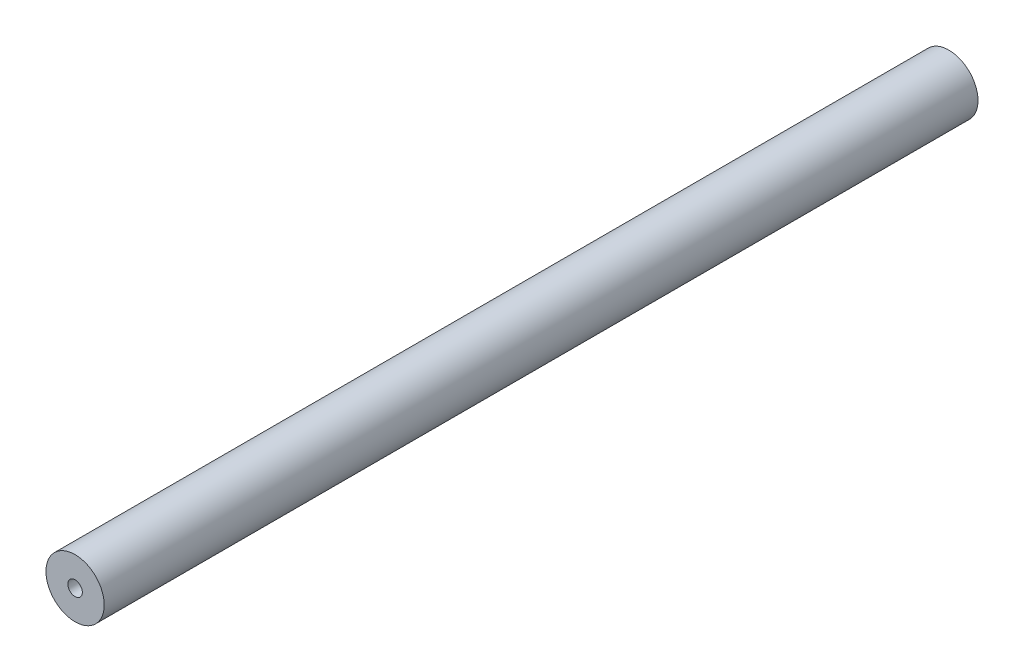
ISO-10303-21;
HEADER;
FILE_DESCRIPTION(('STEP AP214'),'2;1');
FILE_NAME('part.step','',(''),(''),'','','');
FILE_SCHEMA(('AUTOMOTIVE_DESIGN { 1 0 10303 214 1 1 1 1 }'));
ENDSEC;
DATA;
#1=APPLICATION_CONTEXT('core data for automotive mechanical design processes');
#2=APPLICATION_PROTOCOL_DEFINITION('international standard','automotive_design',2000,#1);
#3=PRODUCT_CONTEXT('',#1,'mechanical');
#4=PRODUCT('Part','Part','',(#3));
#5=PRODUCT_RELATED_PRODUCT_CATEGORY('part','',(#4));
#6=PRODUCT_DEFINITION_FORMATION('','',#4);
#7=PRODUCT_DEFINITION_CONTEXT('part definition',#1,'design');
#8=PRODUCT_DEFINITION('design','',#6,#7);
#9=PRODUCT_DEFINITION_SHAPE('','',#8);
#10=(LENGTH_UNIT() NAMED_UNIT(*) SI_UNIT(.MILLI.,.METRE.));
#11=(NAMED_UNIT(*) PLANE_ANGLE_UNIT() SI_UNIT($,.RADIAN.));
#12=(NAMED_UNIT(*) SI_UNIT($,.STERADIAN.) SOLID_ANGLE_UNIT());
#13=UNCERTAINTY_MEASURE_WITH_UNIT(LENGTH_MEASURE(1.E-05),#10,'distance_accuracy_value','');
#14=(GEOMETRIC_REPRESENTATION_CONTEXT(3) GLOBAL_UNCERTAINTY_ASSIGNED_CONTEXT((#13)) GLOBAL_UNIT_ASSIGNED_CONTEXT((#10,
#11,#12)) REPRESENTATION_CONTEXT('',''));
#15=CARTESIAN_POINT('',(0.,0.,0.));
#16=DIRECTION('',(0.,0.,1.));
#17=DIRECTION('',(1.,0.,0.));
#18=AXIS2_PLACEMENT_3D('',#15,#16,#17);
#19=CARTESIAN_POINT('',(0.,0.,1200.));
#20=DIRECTION('',(0.,0.,-1.));
#21=DIRECTION('',(-1.,0.,0.));
#22=AXIS2_PLACEMENT_3D('',#19,#20,#21);
#23=CYLINDRICAL_SURFACE('',#22,40.);
#24=CARTESIAN_POINT('',(0.,0.,1200.));
#25=DIRECTION('',(0.,0.,1.));
#26=DIRECTION('',(1.,0.,0.));
#27=AXIS2_PLACEMENT_3D('',#24,#25,#26);
#28=CIRCLE('',#27,40.);
#29=CARTESIAN_POINT('',(40.,0.,1200.));
#30=VERTEX_POINT('',#29);
#31=EDGE_CURVE('E10',#30,#30,#28,.T.);
#32=ORIENTED_EDGE('',*,*,#31,.F.);
#33=EDGE_LOOP('',(#32));
#34=FACE_BOUND('',#33,.T.);
#35=CARTESIAN_POINT('',(0.,0.,0.));
#36=DIRECTION('',(0.,0.,1.));
#37=DIRECTION('',(1.,0.,0.));
#38=AXIS2_PLACEMENT_3D('',#35,#36,#37);
#39=CIRCLE('',#38,40.);
#40=CARTESIAN_POINT('',(40.,0.,0.));
#41=VERTEX_POINT('',#40);
#42=EDGE_CURVE('E44',#41,#41,#39,.T.);
#43=ORIENTED_EDGE('',*,*,#42,.T.);
#44=EDGE_LOOP('',(#43));
#45=FACE_BOUND('',#44,.T.);
#46=ADVANCED_FACE('F41',(#34,#45),#23,.T.);
#47=CARTESIAN_POINT('',(0.,0.,1200.));
#48=DIRECTION('',(0.,0.,1.));
#49=DIRECTION('',(1.,0.,0.));
#50=AXIS2_PLACEMENT_3D('',#47,#48,#49);
#51=PLANE('',#50);
#52=CARTESIAN_POINT('',(0.,0.,1200.));
#53=DIRECTION('',(0.,0.,1.));
#54=DIRECTION('',(1.,0.,0.));
#55=AXIS2_PLACEMENT_3D('',#52,#53,#54);
#56=CIRCLE('',#55,10.);
#57=CARTESIAN_POINT('',(10.,0.,1200.));
#58=VERTEX_POINT('',#57);
#59=EDGE_CURVE('E57',#58,#58,#56,.T.);
#60=ORIENTED_EDGE('',*,*,#59,.F.);
#61=EDGE_LOOP('',(#60));
#62=FACE_BOUND('',#61,.T.);
#63=ORIENTED_EDGE('',*,*,#31,.T.);
#64=EDGE_LOOP('',(#63));
#65=FACE_BOUND('',#64,.T.);
#66=ADVANCED_FACE('F74',(#62,#65),#51,.T.);
#67=CARTESIAN_POINT('',(0.,0.,0.));
#68=DIRECTION('',(0.,0.,1.));
#69=DIRECTION('',(1.,0.,0.));
#70=AXIS2_PLACEMENT_3D('',#67,#68,#69);
#71=PLANE('',#70);
#72=ORIENTED_EDGE('',*,*,#42,.F.);
#73=EDGE_LOOP('',(#72));
#74=FACE_BOUND('',#73,.T.);
#75=ADVANCED_FACE('F70',(#74),#71,.F.);
#76=CARTESIAN_POINT('',(0.,0.,99.9999999999999));
#77=DIRECTION('',(0.,0.,1.));
#78=DIRECTION('',(1.,0.,0.));
#79=AXIS2_PLACEMENT_3D('',#76,#77,#78);
#80=CYLINDRICAL_SURFACE('',#79,10.);
#81=CARTESIAN_POINT('',(0.,0.,99.9999999999999));
#82=DIRECTION('',(0.,0.,1.));
#83=DIRECTION('',(1.,0.,0.));
#84=AXIS2_PLACEMENT_3D('',#81,#82,#83);
#85=CIRCLE('',#84,10.);
#86=CARTESIAN_POINT('',(10.,0.,99.9999999999999));
#87=VERTEX_POINT('',#86);
#88=EDGE_CURVE('E55',#87,#87,#85,.T.);
#89=ORIENTED_EDGE('',*,*,#88,.F.);
#90=EDGE_LOOP('',(#89));
#91=FACE_BOUND('',#90,.T.);
#92=ORIENTED_EDGE('',*,*,#59,.T.);
#93=EDGE_LOOP('',(#92));
#94=FACE_BOUND('',#93,.T.);
#95=ADVANCED_FACE('F67',(#91,#94),#80,.F.);
#96=CARTESIAN_POINT('',(0.,0.,99.9999999999999));
#97=DIRECTION('',(0.,0.,1.));
#98=DIRECTION('',(1.,0.,0.));
#99=AXIS2_PLACEMENT_3D('',#96,#97,#98);
#100=PLANE('',#99);
#101=ORIENTED_EDGE('',*,*,#88,.T.);
#102=EDGE_LOOP('',(#101));
#103=FACE_BOUND('',#102,.T.);
#104=ADVANCED_FACE('F65',(#103),#100,.T.);
#105=CLOSED_SHELL('',(#46,#66,#75,#95,#104));
#106=MANIFOLD_SOLID_BREP('B2',#105);
#107=ADVANCED_BREP_SHAPE_REPRESENTATION('',(#18,#106),#14);
#108=SHAPE_DEFINITION_REPRESENTATION(#9,#107);
ENDSEC;
END-ISO-10303-21;
